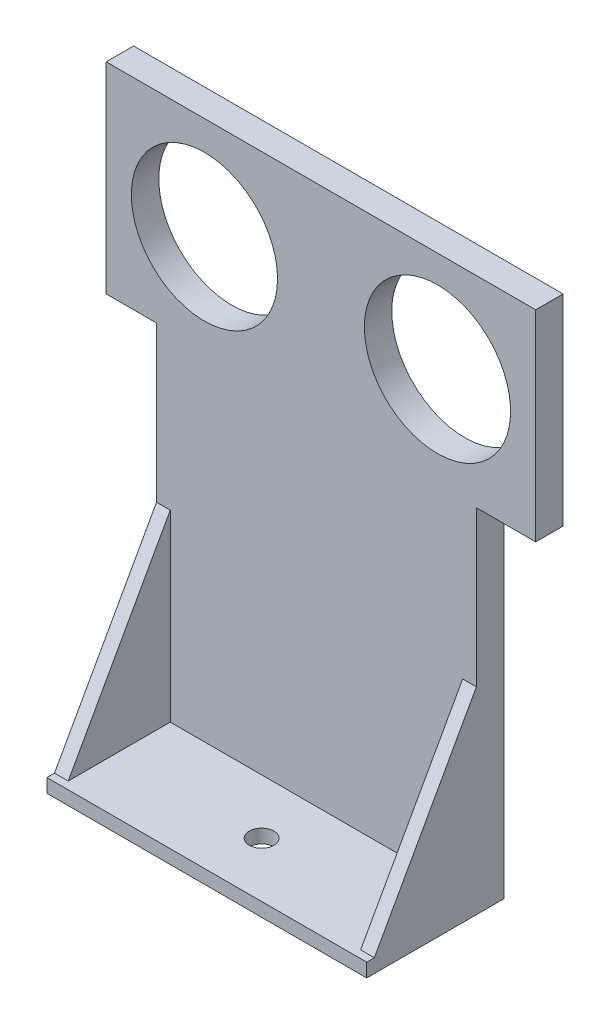
ISO-10303-21;
HEADER;
FILE_DESCRIPTION(('STEP AP214'),'2;1');
FILE_NAME('part.step','',(''),(''),'','','');
FILE_SCHEMA(('AUTOMOTIVE_DESIGN { 1 0 10303 214 1 1 1 1 }'));
ENDSEC;
DATA;
#1=APPLICATION_CONTEXT('core data for automotive mechanical design processes');
#2=APPLICATION_PROTOCOL_DEFINITION('international standard','automotive_design',2000,#1);
#3=PRODUCT_CONTEXT('',#1,'mechanical');
#4=PRODUCT('Part','Part','',(#3));
#5=PRODUCT_RELATED_PRODUCT_CATEGORY('part','',(#4));
#6=PRODUCT_DEFINITION_FORMATION('','',#4);
#7=PRODUCT_DEFINITION_CONTEXT('part definition',#1,'design');
#8=PRODUCT_DEFINITION('design','',#6,#7);
#9=PRODUCT_DEFINITION_SHAPE('','',#8);
#10=(LENGTH_UNIT() NAMED_UNIT(*) SI_UNIT(.MILLI.,.METRE.));
#11=(NAMED_UNIT(*) PLANE_ANGLE_UNIT() SI_UNIT($,.RADIAN.));
#12=(NAMED_UNIT(*) SI_UNIT($,.STERADIAN.) SOLID_ANGLE_UNIT());
#13=UNCERTAINTY_MEASURE_WITH_UNIT(LENGTH_MEASURE(1.E-05),#10,'distance_accuracy_value','');
#14=(GEOMETRIC_REPRESENTATION_CONTEXT(3) GLOBAL_UNCERTAINTY_ASSIGNED_CONTEXT((#13)) GLOBAL_UNIT_ASSIGNED_CONTEXT((#10,
#11,#12)) REPRESENTATION_CONTEXT('',''));
#15=CARTESIAN_POINT('',(0.,0.,0.));
#16=DIRECTION('',(0.,0.,1.));
#17=DIRECTION('',(1.,0.,0.));
#18=AXIS2_PLACEMENT_3D('',#15,#16,#17);
#19=CARTESIAN_POINT('',(-16.,0.,6.));
#20=DIRECTION('',(0.,-1.,0.));
#21=DIRECTION('',(1.,0.,0.));
#22=AXIS2_PLACEMENT_3D('',#19,#20,#21);
#23=PLANE('',#22);
#24=DIRECTION('',(0.,0.,1.));
#25=VECTOR('',#24,1.);
#26=CARTESIAN_POINT('',(-17.5,0.,6.));
#27=LINE('',#26,#25);
#28=CARTESIAN_POINT('',(-17.5,0.,-9.00000000000001));
#29=VERTEX_POINT('',#28);
#30=CARTESIAN_POINT('',(-17.5,0.,6.));
#31=VERTEX_POINT('',#30);
#32=EDGE_CURVE('E317',#29,#31,#27,.T.);
#33=ORIENTED_EDGE('',*,*,#32,.F.);
#34=DIRECTION('',(1.,0.,0.));
#35=VECTOR('',#34,1.);
#36=CARTESIAN_POINT('',(-17.5,0.,-9.00000000000001));
#37=LINE('',#36,#35);
#38=CARTESIAN_POINT('',(17.5,0.,-9.00000000000001));
#39=VERTEX_POINT('',#38);
#40=EDGE_CURVE('E243',#29,#39,#37,.T.);
#41=ORIENTED_EDGE('',*,*,#40,.T.);
#42=DIRECTION('',(0.,0.,-1.));
#43=VECTOR('',#42,1.);
#44=CARTESIAN_POINT('',(17.5,0.,6.));
#45=LINE('',#44,#43);
#46=CARTESIAN_POINT('',(17.5,0.,6.));
#47=VERTEX_POINT('',#46);
#48=EDGE_CURVE('E312',#47,#39,#45,.T.);
#49=ORIENTED_EDGE('',*,*,#48,.F.);
#50=DIRECTION('',(-1.,0.,0.));
#51=VECTOR('',#50,1.);
#52=CARTESIAN_POINT('',(-16.,0.,6.));
#53=LINE('',#52,#51);
#54=EDGE_CURVE('E111',#47,#31,#53,.T.);
#55=ORIENTED_EDGE('',*,*,#54,.T.);
#56=EDGE_LOOP('',(#33,#41,#49,#55));
#57=FACE_BOUND('',#56,.T.);
#58=CARTESIAN_POINT('',(0.,0.,0.));
#59=DIRECTION('',(0.,1.,0.));
#60=DIRECTION('',(0.,0.,1.));
#61=AXIS2_PLACEMENT_3D('',#58,#59,#60);
#62=CIRCLE('',#61,1.35);
#63=CARTESIAN_POINT('',(0.,0.,1.35));
#64=VERTEX_POINT('',#63);
#65=EDGE_CURVE('E370',#64,#64,#62,.T.);
#66=ORIENTED_EDGE('',*,*,#65,.T.);
#67=EDGE_LOOP('',(#66));
#68=FACE_BOUND('',#67,.T.);
#69=ADVANCED_FACE('F103',(#57,#68),#23,.T.);
#70=CARTESIAN_POINT('',(-16.,21.59,-6.));
#71=DIRECTION('',(0.,0.485814790232148,0.87406177675934));
#72=DIRECTION('',(0.,-0.87406177675934,0.485814790232148));
#73=AXIS2_PLACEMENT_3D('',#70,#71,#72);
#74=PLANE('',#73);
#75=DIRECTION('',(-1.,0.,0.));
#76=VECTOR('',#75,1.);
#77=CARTESIAN_POINT('',(-16.,1.5,5.16628068550254));
#78=LINE('',#77,#76);
#79=CARTESIAN_POINT('',(-16.,1.5,5.16628068550254));
#80=VERTEX_POINT('',#79);
#81=CARTESIAN_POINT('',(-17.5,1.5,5.16628068550254));
#82=VERTEX_POINT('',#81);
#83=EDGE_CURVE('E322',#80,#82,#78,.T.);
#84=ORIENTED_EDGE('',*,*,#83,.F.);
#85=DIRECTION('',(0.,0.87406177675934,-0.485814790232148));
#86=VECTOR('',#85,1.);
#87=CARTESIAN_POINT('',(-16.,21.59,-6.));
#88=LINE('',#87,#86);
#89=CARTESIAN_POINT('',(-16.,21.59,-6.));
#90=VERTEX_POINT('',#89);
#91=EDGE_CURVE('E338',#80,#90,#88,.T.);
#92=ORIENTED_EDGE('',*,*,#91,.T.);
#93=DIRECTION('',(-1.,0.,0.));
#94=VECTOR('',#93,1.);
#95=CARTESIAN_POINT('',(-16.,21.59,-6.));
#96=LINE('',#95,#94);
#97=CARTESIAN_POINT('',(-17.5,21.59,-6.));
#98=VERTEX_POINT('',#97);
#99=EDGE_CURVE('E12',#90,#98,#96,.T.);
#100=ORIENTED_EDGE('',*,*,#99,.T.);
#101=DIRECTION('',(0.,0.87406177675934,-0.485814790232148));
#102=VECTOR('',#101,1.);
#103=CARTESIAN_POINT('',(-17.5,21.59,-6.));
#104=LINE('',#103,#102);
#105=EDGE_CURVE('E321',#82,#98,#104,.T.);
#106=ORIENTED_EDGE('',*,*,#105,.F.);
#107=EDGE_LOOP('',(#84,#92,#100,#106));
#108=FACE_BOUND('',#107,.T.);
#109=ADVANCED_FACE('F340',(#108),#74,.T.);
#110=CARTESIAN_POINT('',(-16.,0.,0.));
#111=DIRECTION('',(1.,0.,0.));
#112=DIRECTION('',(0.,1.,0.));
#113=AXIS2_PLACEMENT_3D('',#110,#111,#112);
#114=PLANE('',#113);
#115=DIRECTION('',(0.,0.,1.));
#116=VECTOR('',#115,1.);
#117=CARTESIAN_POINT('',(-16.,1.5,0.));
#118=LINE('',#117,#116);
#119=CARTESIAN_POINT('',(-16.,1.5,-6.));
#120=VERTEX_POINT('',#119);
#121=EDGE_CURVE('E347',#120,#80,#118,.T.);
#122=ORIENTED_EDGE('',*,*,#121,.F.);
#123=DIRECTION('',(0.,-1.,0.));
#124=VECTOR('',#123,1.);
#125=CARTESIAN_POINT('',(-16.,0.,-6.));
#126=LINE('',#125,#124);
#127=EDGE_CURVE('E344',#90,#120,#126,.T.);
#128=ORIENTED_EDGE('',*,*,#127,.F.);
#129=ORIENTED_EDGE('',*,*,#91,.F.);
#130=EDGE_LOOP('',(#122,#128,#129));
#131=FACE_BOUND('',#130,.T.);
#132=ADVANCED_FACE('F346',(#131),#114,.T.);
#133=CARTESIAN_POINT('',(-17.5,0.,0.));
#134=DIRECTION('',(1.,0.,0.));
#135=DIRECTION('',(0.,1.,0.));
#136=AXIS2_PLACEMENT_3D('',#133,#134,#135);
#137=PLANE('',#136);
#138=ORIENTED_EDGE('',*,*,#105,.T.);
#139=DIRECTION('',(0.,1.,0.));
#140=VECTOR('',#139,1.);
#141=CARTESIAN_POINT('',(-17.5,0.,-6.));
#142=LINE('',#141,#140);
#143=CARTESIAN_POINT('',(-17.5,38.5736652863619,-6.));
#144=VERTEX_POINT('',#143);
#145=EDGE_CURVE('E259',#98,#144,#142,.T.);
#146=ORIENTED_EDGE('',*,*,#145,.T.);
#147=DIRECTION('',(0.,0.,1.));
#148=VECTOR('',#147,1.);
#149=CARTESIAN_POINT('',(-17.5,38.5736652863619,-9.00000000000001));
#150=LINE('',#149,#148);
#151=CARTESIAN_POINT('',(-17.5,38.5736652863619,-9.00000000000001));
#152=VERTEX_POINT('',#151);
#153=EDGE_CURVE('E291',#152,#144,#150,.T.);
#154=ORIENTED_EDGE('',*,*,#153,.F.);
#155=DIRECTION('',(0.,1.,0.));
#156=VECTOR('',#155,1.);
#157=CARTESIAN_POINT('',(-17.5,0.,-9.00000000000001));
#158=LINE('',#157,#156);
#159=EDGE_CURVE('E241',#29,#152,#158,.T.);
#160=ORIENTED_EDGE('',*,*,#159,.F.);
#161=ORIENTED_EDGE('',*,*,#32,.T.);
#162=DIRECTION('',(0.,-1.,0.));
#163=VECTOR('',#162,1.);
#164=CARTESIAN_POINT('',(-17.5,1.5,6.));
#165=LINE('',#164,#163);
#166=CARTESIAN_POINT('',(-17.5,1.5,6.));
#167=VERTEX_POINT('',#166);
#168=EDGE_CURVE('E356',#167,#31,#165,.T.);
#169=ORIENTED_EDGE('',*,*,#168,.F.);
#170=DIRECTION('',(0.,0.,-1.));
#171=VECTOR('',#170,1.);
#172=CARTESIAN_POINT('',(-17.5,1.5,6.));
#173=LINE('',#172,#171);
#174=EDGE_CURVE('E335',#167,#82,#173,.T.);
#175=ORIENTED_EDGE('',*,*,#174,.T.);
#176=EDGE_LOOP('',(#138,#146,#154,#160,#161,#169,#175));
#177=FACE_BOUND('',#176,.T.);
#178=ADVANCED_FACE('F325',(#177),#137,.F.);
#179=CARTESIAN_POINT('',(0.,1.5,0.));
#180=DIRECTION('',(0.,1.,0.));
#181=DIRECTION('',(0.,0.,1.));
#182=AXIS2_PLACEMENT_3D('',#179,#180,#181);
#183=PLANE('',#182);
#184=DIRECTION('',(1.,0.,0.));
#185=VECTOR('',#184,1.);
#186=CARTESIAN_POINT('',(0.,1.5,5.16637598499684));
#187=LINE('',#186,#185);
#188=CARTESIAN_POINT('',(16.,1.5,5.16637598499684));
#189=VERTEX_POINT('',#188);
#190=CARTESIAN_POINT('',(17.5,1.5,5.16637598499684));
#191=VERTEX_POINT('',#190);
#192=EDGE_CURVE('E119',#189,#191,#187,.T.);
#193=ORIENTED_EDGE('',*,*,#192,.F.);
#194=DIRECTION('',(0.,0.,1.));
#195=VECTOR('',#194,1.);
#196=CARTESIAN_POINT('',(16.,1.5,0.));
#197=LINE('',#196,#195);
#198=CARTESIAN_POINT('',(16.,1.5,-6.));
#199=VERTEX_POINT('',#198);
#200=EDGE_CURVE('E123',#199,#189,#197,.T.);
#201=ORIENTED_EDGE('',*,*,#200,.F.);
#202=DIRECTION('',(-1.,0.,0.));
#203=VECTOR('',#202,1.);
#204=CARTESIAN_POINT('',(17.5,1.5,-6.));
#205=LINE('',#204,#203);
#206=EDGE_CURVE('E367',#199,#120,#205,.T.);
#207=ORIENTED_EDGE('',*,*,#206,.T.);
#208=ORIENTED_EDGE('',*,*,#121,.T.);
#209=ORIENTED_EDGE('',*,*,#83,.T.);
#210=ORIENTED_EDGE('',*,*,#174,.F.);
#211=DIRECTION('',(-1.,0.,0.));
#212=VECTOR('',#211,1.);
#213=CARTESIAN_POINT('',(17.5,1.5,6.));
#214=LINE('',#213,#212);
#215=CARTESIAN_POINT('',(17.5,1.5,6.));
#216=VERTEX_POINT('',#215);
#217=EDGE_CURVE('E360',#216,#167,#214,.T.);
#218=ORIENTED_EDGE('',*,*,#217,.F.);
#219=DIRECTION('',(0.,0.,-1.));
#220=VECTOR('',#219,1.);
#221=CARTESIAN_POINT('',(17.5,1.5,6.));
#222=LINE('',#221,#220);
#223=EDGE_CURVE('E362',#216,#191,#222,.T.);
#224=ORIENTED_EDGE('',*,*,#223,.T.);
#225=EDGE_LOOP('',(#193,#201,#207,#208,#209,#210,#218,#224));
#226=FACE_BOUND('',#225,.T.);
#227=CARTESIAN_POINT('',(0.,1.5,0.));
#228=DIRECTION('',(0.,1.,0.));
#229=DIRECTION('',(0.,0.,1.));
#230=AXIS2_PLACEMENT_3D('',#227,#228,#229);
#231=CIRCLE('',#230,1.35);
#232=CARTESIAN_POINT('',(0.,1.5,1.35));
#233=VERTEX_POINT('',#232);
#234=EDGE_CURVE('E363',#233,#233,#231,.T.);
#235=ORIENTED_EDGE('',*,*,#234,.F.);
#236=EDGE_LOOP('',(#235));
#237=FACE_BOUND('',#236,.T.);
#238=ADVANCED_FACE('F379',(#226,#237),#183,.T.);
#239=CARTESIAN_POINT('',(17.5,1.5,6.));
#240=DIRECTION('',(-1.,0.,0.));
#241=DIRECTION('',(0.,0.,1.));
#242=AXIS2_PLACEMENT_3D('',#239,#240,#241);
#243=PLANE('',#242);
#244=DIRECTION('',(0.,-1.,0.));
#245=VECTOR('',#244,1.);
#246=CARTESIAN_POINT('',(17.5,1.5,6.));
#247=LINE('',#246,#245);
#248=EDGE_CURVE('E358',#216,#47,#247,.T.);
#249=ORIENTED_EDGE('',*,*,#248,.T.);
#250=ORIENTED_EDGE('',*,*,#48,.T.);
#251=DIRECTION('',(0.,1.,0.));
#252=VECTOR('',#251,1.);
#253=CARTESIAN_POINT('',(17.5,0.,-9.00000000000001));
#254=LINE('',#253,#252);
#255=CARTESIAN_POINT('',(17.5,38.5736652863619,-9.00000000000001));
#256=VERTEX_POINT('',#255);
#257=EDGE_CURVE('E246',#39,#256,#254,.T.);
#258=ORIENTED_EDGE('',*,*,#257,.T.);
#259=DIRECTION('',(0.,0.,1.));
#260=VECTOR('',#259,1.);
#261=CARTESIAN_POINT('',(17.5,38.5736652863619,-9.00000000000001));
#262=LINE('',#261,#260);
#263=CARTESIAN_POINT('',(17.5,38.5736652863619,-6.));
#264=VERTEX_POINT('',#263);
#265=EDGE_CURVE('E286',#256,#264,#262,.T.);
#266=ORIENTED_EDGE('',*,*,#265,.T.);
#267=DIRECTION('',(0.,1.,0.));
#268=VECTOR('',#267,1.);
#269=CARTESIAN_POINT('',(17.5,0.,-6.));
#270=LINE('',#269,#268);
#271=CARTESIAN_POINT('',(17.5,21.5924681583601,-6.));
#272=VERTEX_POINT('',#271);
#273=EDGE_CURVE('E232',#272,#264,#270,.T.);
#274=ORIENTED_EDGE('',*,*,#273,.F.);
#275=DIRECTION('',(0.,-0.874085356937327,0.485772363137041));
#276=VECTOR('',#275,1.);
#277=CARTESIAN_POINT('',(17.5,21.5924681583601,-6.));
#278=LINE('',#277,#276);
#279=EDGE_CURVE('E271',#272,#191,#278,.T.);
#280=ORIENTED_EDGE('',*,*,#279,.T.);
#281=ORIENTED_EDGE('',*,*,#223,.F.);
#282=EDGE_LOOP('',(#249,#250,#258,#266,#274,#280,#281));
#283=FACE_BOUND('',#282,.T.);
#284=ADVANCED_FACE('F310',(#283),#243,.F.);
#285=CARTESIAN_POINT('',(17.5,1.5,6.));
#286=DIRECTION('',(0.,0.,1.));
#287=DIRECTION('',(1.,0.,0.));
#288=AXIS2_PLACEMENT_3D('',#285,#286,#287);
#289=PLANE('',#288);
#290=ORIENTED_EDGE('',*,*,#54,.F.);
#291=ORIENTED_EDGE('',*,*,#248,.F.);
#292=ORIENTED_EDGE('',*,*,#217,.T.);
#293=ORIENTED_EDGE('',*,*,#168,.T.);
#294=EDGE_LOOP('',(#290,#291,#292,#293));
#295=FACE_BOUND('',#294,.T.);
#296=ADVANCED_FACE('F383',(#295),#289,.T.);
#297=CARTESIAN_POINT('',(0.,1.5,0.));
#298=DIRECTION('',(0.,-1.,0.));
#299=DIRECTION('',(0.,0.,-1.));
#300=AXIS2_PLACEMENT_3D('',#297,#298,#299);
#301=CYLINDRICAL_SURFACE('',#300,1.35);
#302=ORIENTED_EDGE('',*,*,#234,.T.);
#303=EDGE_LOOP('',(#302));
#304=FACE_BOUND('',#303,.T.);
#305=ORIENTED_EDGE('',*,*,#65,.F.);
#306=EDGE_LOOP('',(#305));
#307=FACE_BOUND('',#306,.T.);
#308=ADVANCED_FACE('F385',(#304,#307),#301,.F.);
#309=CARTESIAN_POINT('',(16.,21.5924681583601,-6.));
#310=DIRECTION('',(0.,0.485772363137041,0.874085356937327));
#311=DIRECTION('',(0.,-0.874085356937327,0.485772363137041));
#312=AXIS2_PLACEMENT_3D('',#309,#310,#311);
#313=PLANE('',#312);
#314=DIRECTION('',(0.,-0.874085356937327,0.485772363137041));
#315=VECTOR('',#314,1.);
#316=CARTESIAN_POINT('',(16.,21.5924681583601,-6.));
#317=LINE('',#316,#315);
#318=CARTESIAN_POINT('',(16.,21.5924681583601,-6.));
#319=VERTEX_POINT('',#318);
#320=EDGE_CURVE('E270',#319,#189,#317,.T.);
#321=ORIENTED_EDGE('',*,*,#320,.T.);
#322=ORIENTED_EDGE('',*,*,#192,.T.);
#323=ORIENTED_EDGE('',*,*,#279,.F.);
#324=DIRECTION('',(1.,0.,0.));
#325=VECTOR('',#324,1.);
#326=CARTESIAN_POINT('',(16.,21.5924681583601,-6.));
#327=LINE('',#326,#325);
#328=EDGE_CURVE('E274',#319,#272,#327,.T.);
#329=ORIENTED_EDGE('',*,*,#328,.F.);
#330=EDGE_LOOP('',(#321,#322,#323,#329));
#331=FACE_BOUND('',#330,.T.);
#332=ADVANCED_FACE('F378',(#331),#313,.T.);
#333=CARTESIAN_POINT('',(16.,0.,0.));
#334=DIRECTION('',(-1.,0.,0.));
#335=DIRECTION('',(0.,0.,1.));
#336=AXIS2_PLACEMENT_3D('',#333,#334,#335);
#337=PLANE('',#336);
#338=DIRECTION('',(0.,1.,0.));
#339=VECTOR('',#338,1.);
#340=CARTESIAN_POINT('',(16.,0.,-6.));
#341=LINE('',#340,#339);
#342=EDGE_CURVE('E267',#199,#319,#341,.T.);
#343=ORIENTED_EDGE('',*,*,#342,.F.);
#344=ORIENTED_EDGE('',*,*,#200,.T.);
#345=ORIENTED_EDGE('',*,*,#320,.F.);
#346=EDGE_LOOP('',(#343,#344,#345));
#347=FACE_BOUND('',#346,.T.);
#348=ADVANCED_FACE('F377',(#347),#337,.T.);
#349=CARTESIAN_POINT('',(0.,0.,-9.00000000000001));
#350=DIRECTION('',(0.,0.,1.));
#351=DIRECTION('',(1.,0.,0.));
#352=AXIS2_PLACEMENT_3D('',#349,#350,#351);
#353=PLANE('',#352);
#354=CARTESIAN_POINT('',(-12.2598127408109,49.3745989097653,-9.00000000000001));
#355=DIRECTION('',(0.,0.,1.));
#356=DIRECTION('',(1.,0.,0.));
#357=AXIS2_PLACEMENT_3D('',#354,#355,#356);
#358=CIRCLE('',#357,8.);
#359=CARTESIAN_POINT('',(-4.25981274081085,49.3745989097653,-9.00000000000001));
#360=VERTEX_POINT('',#359);
#361=EDGE_CURVE('E252',#360,#360,#358,.T.);
#362=ORIENTED_EDGE('',*,*,#361,.T.);
#363=EDGE_LOOP('',(#362));
#364=FACE_BOUND('',#363,.T.);
#365=DIRECTION('',(0.,1.,0.));
#366=VECTOR('',#365,1.);
#367=CARTESIAN_POINT('',(23.9901872591891,38.573665286362,-9.00000000000001));
#368=LINE('',#367,#366);
#369=CARTESIAN_POINT('',(23.9901872591891,38.573665286362,-9.00000000000001));
#370=VERTEX_POINT('',#369);
#371=CARTESIAN_POINT('',(23.9901872591891,60.5736652863619,-9.00000000000001));
#372=VERTEX_POINT('',#371);
#373=EDGE_CURVE('E221',#370,#372,#368,.T.);
#374=ORIENTED_EDGE('',*,*,#373,.F.);
#375=DIRECTION('',(-1.,0.,0.));
#376=VECTOR('',#375,1.);
#377=CARTESIAN_POINT('',(23.9901872591891,38.573665286362,-9.00000000000001));
#378=LINE('',#377,#376);
#379=EDGE_CURVE('E215',#370,#256,#378,.T.);
#380=ORIENTED_EDGE('',*,*,#379,.T.);
#381=ORIENTED_EDGE('',*,*,#257,.F.);
#382=ORIENTED_EDGE('',*,*,#40,.F.);
#383=ORIENTED_EDGE('',*,*,#159,.T.);
#384=DIRECTION('',(-1.,0.,0.));
#385=VECTOR('',#384,1.);
#386=CARTESIAN_POINT('',(-17.5,38.5736652863619,-9.00000000000001));
#387=LINE('',#386,#385);
#388=CARTESIAN_POINT('',(-23.0098127408109,38.573665286362,-9.00000000000001));
#389=VERTEX_POINT('',#388);
#390=EDGE_CURVE('E239',#152,#389,#387,.T.);
#391=ORIENTED_EDGE('',*,*,#390,.T.);
#392=DIRECTION('',(0.,1.,0.));
#393=VECTOR('',#392,1.);
#394=CARTESIAN_POINT('',(-23.0098127408109,38.573665286362,-9.00000000000001));
#395=LINE('',#394,#393);
#396=CARTESIAN_POINT('',(-23.0098127408109,60.5736652863619,-9.00000000000001));
#397=VERTEX_POINT('',#396);
#398=EDGE_CURVE('E223',#389,#397,#395,.T.);
#399=ORIENTED_EDGE('',*,*,#398,.T.);
#400=DIRECTION('',(-1.,0.,0.));
#401=VECTOR('',#400,1.);
#402=CARTESIAN_POINT('',(23.9901872591891,60.5736652863619,-9.00000000000001));
#403=LINE('',#402,#401);
#404=EDGE_CURVE('E207',#372,#397,#403,.T.);
#405=ORIENTED_EDGE('',*,*,#404,.F.);
#406=EDGE_LOOP('',(#374,#380,#381,#382,#383,#391,#399,#405));
#407=FACE_BOUND('',#406,.T.);
#408=CARTESIAN_POINT('',(13.2401872591891,49.573665286362,-9.00000000000001));
#409=DIRECTION('',(0.,0.,-1.));
#410=DIRECTION('',(-1.,0.,0.));
#411=AXIS2_PLACEMENT_3D('',#408,#409,#410);
#412=CIRCLE('',#411,8.);
#413=CARTESIAN_POINT('',(5.24018725918915,49.573665286362,-9.00000000000001));
#414=VERTEX_POINT('',#413);
#415=EDGE_CURVE('E442',#414,#414,#412,.T.);
#416=ORIENTED_EDGE('',*,*,#415,.F.);
#417=EDGE_LOOP('',(#416));
#418=FACE_BOUND('',#417,.T.);
#419=ADVANCED_FACE('F219',(#364,#407,#418),#353,.F.);
#420=CARTESIAN_POINT('',(0.,0.,-6.));
#421=DIRECTION('',(0.,0.,1.));
#422=DIRECTION('',(1.,0.,0.));
#423=AXIS2_PLACEMENT_3D('',#420,#421,#422);
#424=PLANE('',#423);
#425=ORIENTED_EDGE('',*,*,#342,.T.);
#426=ORIENTED_EDGE('',*,*,#328,.T.);
#427=ORIENTED_EDGE('',*,*,#273,.T.);
#428=DIRECTION('',(-1.,0.,0.));
#429=VECTOR('',#428,1.);
#430=CARTESIAN_POINT('',(23.9901872591891,38.573665286362,-6.));
#431=LINE('',#430,#429);
#432=CARTESIAN_POINT('',(23.9901872591891,38.573665286362,-6.));
#433=VERTEX_POINT('',#432);
#434=EDGE_CURVE('E229',#433,#264,#431,.T.);
#435=ORIENTED_EDGE('',*,*,#434,.F.);
#436=DIRECTION('',(0.,1.,0.));
#437=VECTOR('',#436,1.);
#438=CARTESIAN_POINT('',(23.9901872591891,38.573665286362,-6.));
#439=LINE('',#438,#437);
#440=CARTESIAN_POINT('',(23.9901872591891,60.5736652863619,-6.));
#441=VERTEX_POINT('',#440);
#442=EDGE_CURVE('E250',#433,#441,#439,.T.);
#443=ORIENTED_EDGE('',*,*,#442,.T.);
#444=DIRECTION('',(-1.,0.,0.));
#445=VECTOR('',#444,1.);
#446=CARTESIAN_POINT('',(23.9901872591891,60.5736652863619,-6.));
#447=LINE('',#446,#445);
#448=CARTESIAN_POINT('',(-23.0098127408109,60.5736652863619,-6.));
#449=VERTEX_POINT('',#448);
#450=EDGE_CURVE('E209',#441,#449,#447,.T.);
#451=ORIENTED_EDGE('',*,*,#450,.T.);
#452=DIRECTION('',(0.,1.,0.));
#453=VECTOR('',#452,1.);
#454=CARTESIAN_POINT('',(-23.0098127408109,38.573665286362,-6.));
#455=LINE('',#454,#453);
#456=CARTESIAN_POINT('',(-23.0098127408109,38.573665286362,-6.));
#457=VERTEX_POINT('',#456);
#458=EDGE_CURVE('E254',#457,#449,#455,.T.);
#459=ORIENTED_EDGE('',*,*,#458,.F.);
#460=DIRECTION('',(-1.,0.,0.));
#461=VECTOR('',#460,1.);
#462=CARTESIAN_POINT('',(-17.5,38.5736652863619,-6.));
#463=LINE('',#462,#461);
#464=EDGE_CURVE('E257',#144,#457,#463,.T.);
#465=ORIENTED_EDGE('',*,*,#464,.F.);
#466=ORIENTED_EDGE('',*,*,#145,.F.);
#467=ORIENTED_EDGE('',*,*,#99,.F.);
#468=ORIENTED_EDGE('',*,*,#127,.T.);
#469=ORIENTED_EDGE('',*,*,#206,.F.);
#470=EDGE_LOOP('',(#425,#426,#427,#435,#443,#451,#459,#465,#466,#467,#468,#469));
#471=FACE_BOUND('',#470,.T.);
#472=CARTESIAN_POINT('',(-12.2598127408109,49.3745989097653,-6.));
#473=DIRECTION('',(0.,0.,1.));
#474=DIRECTION('',(1.,0.,0.));
#475=AXIS2_PLACEMENT_3D('',#472,#473,#474);
#476=CIRCLE('',#475,8.);
#477=CARTESIAN_POINT('',(-4.25981274081085,49.3745989097653,-6.));
#478=VERTEX_POINT('',#477);
#479=EDGE_CURVE('E235',#478,#478,#476,.T.);
#480=ORIENTED_EDGE('',*,*,#479,.F.);
#481=EDGE_LOOP('',(#480));
#482=FACE_BOUND('',#481,.T.);
#483=CARTESIAN_POINT('',(13.2401872591891,49.573665286362,-6.));
#484=DIRECTION('',(0.,0.,-1.));
#485=DIRECTION('',(-1.,0.,0.));
#486=AXIS2_PLACEMENT_3D('',#483,#484,#485);
#487=CIRCLE('',#486,8.);
#488=CARTESIAN_POINT('',(5.24018725918915,49.573665286362,-6.));
#489=VERTEX_POINT('',#488);
#490=EDGE_CURVE('E445',#489,#489,#487,.T.);
#491=ORIENTED_EDGE('',*,*,#490,.T.);
#492=EDGE_LOOP('',(#491));
#493=FACE_BOUND('',#492,.T.);
#494=ADVANCED_FACE('F304',(#471,#482,#493),#424,.T.);
#495=CARTESIAN_POINT('',(23.9901872591891,38.573665286362,-9.00000000000001));
#496=DIRECTION('',(1.,0.,0.));
#497=DIRECTION('',(0.,0.,-1.));
#498=AXIS2_PLACEMENT_3D('',#495,#496,#497);
#499=PLANE('',#498);
#500=ORIENTED_EDGE('',*,*,#442,.F.);
#501=DIRECTION('',(0.,0.,1.));
#502=VECTOR('',#501,1.);
#503=CARTESIAN_POINT('',(23.9901872591891,38.573665286362,-9.00000000000001));
#504=LINE('',#503,#502);
#505=EDGE_CURVE('E227',#370,#433,#504,.T.);
#506=ORIENTED_EDGE('',*,*,#505,.F.);
#507=ORIENTED_EDGE('',*,*,#373,.T.);
#508=DIRECTION('',(0.,0.,1.));
#509=VECTOR('',#508,1.);
#510=CARTESIAN_POINT('',(23.9901872591891,60.5736652863619,-9.00000000000001));
#511=LINE('',#510,#509);
#512=EDGE_CURVE('E204',#372,#441,#511,.T.);
#513=ORIENTED_EDGE('',*,*,#512,.T.);
#514=EDGE_LOOP('',(#500,#506,#507,#513));
#515=FACE_BOUND('',#514,.T.);
#516=ADVANCED_FACE('F226',(#515),#499,.T.);
#517=CARTESIAN_POINT('',(23.9901872591891,38.573665286362,-9.00000000000001));
#518=DIRECTION('',(0.,1.,0.));
#519=DIRECTION('',(-1.,0.,0.));
#520=AXIS2_PLACEMENT_3D('',#517,#518,#519);
#521=PLANE('',#520);
#522=ORIENTED_EDGE('',*,*,#434,.T.);
#523=ORIENTED_EDGE('',*,*,#265,.F.);
#524=ORIENTED_EDGE('',*,*,#379,.F.);
#525=ORIENTED_EDGE('',*,*,#505,.T.);
#526=EDGE_LOOP('',(#522,#523,#524,#525));
#527=FACE_BOUND('',#526,.T.);
#528=ADVANCED_FACE('F307',(#527),#521,.F.);
#529=CARTESIAN_POINT('',(-17.5,38.5736652863619,-9.00000000000001));
#530=DIRECTION('',(0.,1.,0.));
#531=DIRECTION('',(-1.,0.,0.));
#532=AXIS2_PLACEMENT_3D('',#529,#530,#531);
#533=PLANE('',#532);
#534=ORIENTED_EDGE('',*,*,#464,.T.);
#535=DIRECTION('',(0.,0.,1.));
#536=VECTOR('',#535,1.);
#537=CARTESIAN_POINT('',(-23.0098127408109,38.573665286362,-9.00000000000001));
#538=LINE('',#537,#536);
#539=EDGE_CURVE('E296',#389,#457,#538,.T.);
#540=ORIENTED_EDGE('',*,*,#539,.F.);
#541=ORIENTED_EDGE('',*,*,#390,.F.);
#542=ORIENTED_EDGE('',*,*,#153,.T.);
#543=EDGE_LOOP('',(#534,#540,#541,#542));
#544=FACE_BOUND('',#543,.T.);
#545=ADVANCED_FACE('F328',(#544),#533,.F.);
#546=CARTESIAN_POINT('',(-23.0098127408109,38.573665286362,-9.00000000000001));
#547=DIRECTION('',(1.,0.,0.));
#548=DIRECTION('',(0.,0.,-1.));
#549=AXIS2_PLACEMENT_3D('',#546,#547,#548);
#550=PLANE('',#549);
#551=ORIENTED_EDGE('',*,*,#458,.T.);
#552=DIRECTION('',(0.,0.,1.));
#553=VECTOR('',#552,1.);
#554=CARTESIAN_POINT('',(-23.0098127408109,60.5736652863619,-9.00000000000001));
#555=LINE('',#554,#553);
#556=EDGE_CURVE('E214',#397,#449,#555,.T.);
#557=ORIENTED_EDGE('',*,*,#556,.F.);
#558=ORIENTED_EDGE('',*,*,#398,.F.);
#559=ORIENTED_EDGE('',*,*,#539,.T.);
#560=EDGE_LOOP('',(#551,#557,#558,#559));
#561=FACE_BOUND('',#560,.T.);
#562=ADVANCED_FACE('F300',(#561),#550,.F.);
#563=CARTESIAN_POINT('',(23.9901872591891,60.5736652863619,-9.00000000000001));
#564=DIRECTION('',(0.,1.,0.));
#565=DIRECTION('',(0.,0.,1.));
#566=AXIS2_PLACEMENT_3D('',#563,#564,#565);
#567=PLANE('',#566);
#568=ORIENTED_EDGE('',*,*,#450,.F.);
#569=ORIENTED_EDGE('',*,*,#512,.F.);
#570=ORIENTED_EDGE('',*,*,#404,.T.);
#571=ORIENTED_EDGE('',*,*,#556,.T.);
#572=EDGE_LOOP('',(#568,#569,#570,#571));
#573=FACE_BOUND('',#572,.T.);
#574=ADVANCED_FACE('F206',(#573),#567,.T.);
#575=CARTESIAN_POINT('',(-12.2598127408109,49.3745989097653,-9.00000000000001));
#576=DIRECTION('',(0.,0.,1.));
#577=DIRECTION('',(1.,0.,0.));
#578=AXIS2_PLACEMENT_3D('',#575,#576,#577);
#579=CYLINDRICAL_SURFACE('',#578,8.);
#580=ORIENTED_EDGE('',*,*,#361,.F.);
#581=EDGE_LOOP('',(#580));
#582=FACE_BOUND('',#581,.T.);
#583=ORIENTED_EDGE('',*,*,#479,.T.);
#584=EDGE_LOOP('',(#583));
#585=FACE_BOUND('',#584,.T.);
#586=ADVANCED_FACE('F419',(#582,#585),#579,.F.);
#587=CARTESIAN_POINT('',(13.2401872591891,49.573665286362,-9.00000000000001));
#588=DIRECTION('',(0.,0.,1.));
#589=DIRECTION('',(1.,0.,0.));
#590=AXIS2_PLACEMENT_3D('',#587,#588,#589);
#591=CYLINDRICAL_SURFACE('',#590,8.);
#592=ORIENTED_EDGE('',*,*,#415,.T.);
#593=EDGE_LOOP('',(#592));
#594=FACE_BOUND('',#593,.T.);
#595=ORIENTED_EDGE('',*,*,#490,.F.);
#596=EDGE_LOOP('',(#595));
#597=FACE_BOUND('',#596,.T.);
#598=ADVANCED_FACE('F433',(#594,#597),#591,.F.);
#599=CLOSED_SHELL('',(#69,#109,#132,#178,#238,#284,#296,#308,#332,#348,#419,#494,#516,#528,#545,
#562,#574,#586,#598));
#600=MANIFOLD_SOLID_BREP('B2',#599);
#601=ADVANCED_BREP_SHAPE_REPRESENTATION('',(#18,#600),#14);
#602=SHAPE_DEFINITION_REPRESENTATION(#9,#601);
ENDSEC;
END-ISO-10303-21;
